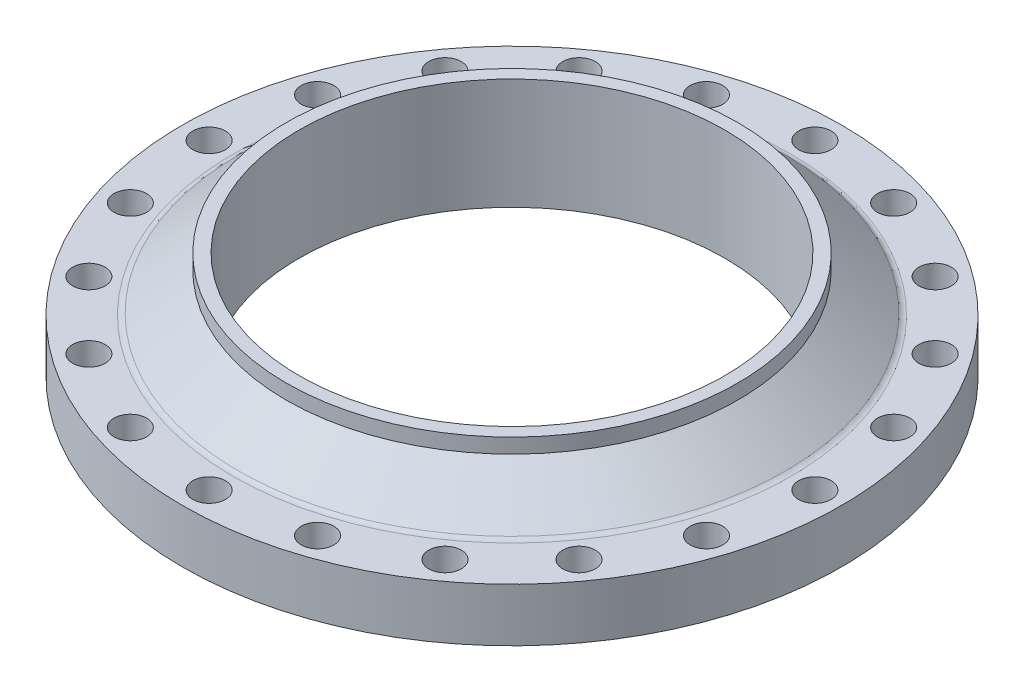
ISO-10303-21;
HEADER;
FILE_DESCRIPTION(('STEP AP214'),'2;1');
FILE_NAME('part.step','',(''),(''),'','','');
FILE_SCHEMA(('AUTOMOTIVE_DESIGN { 1 0 10303 214 1 1 1 1 }'));
ENDSEC;
DATA;
#1=APPLICATION_CONTEXT('core data for automotive mechanical design processes');
#2=APPLICATION_PROTOCOL_DEFINITION('international standard','automotive_design',2000,#1);
#3=PRODUCT_CONTEXT('',#1,'mechanical');
#4=PRODUCT('Part','Part','',(#3));
#5=PRODUCT_RELATED_PRODUCT_CATEGORY('part','',(#4));
#6=PRODUCT_DEFINITION_FORMATION('','',#4);
#7=PRODUCT_DEFINITION_CONTEXT('part definition',#1,'design');
#8=PRODUCT_DEFINITION('design','',#6,#7);
#9=PRODUCT_DEFINITION_SHAPE('','',#8);
#10=(LENGTH_UNIT() NAMED_UNIT(*) SI_UNIT(.MILLI.,.METRE.));
#11=(NAMED_UNIT(*) PLANE_ANGLE_UNIT() SI_UNIT($,.RADIAN.));
#12=(NAMED_UNIT(*) SI_UNIT($,.STERADIAN.) SOLID_ANGLE_UNIT());
#13=UNCERTAINTY_MEASURE_WITH_UNIT(LENGTH_MEASURE(1.E-05),#10,'distance_accuracy_value','');
#14=(GEOMETRIC_REPRESENTATION_CONTEXT(3) GLOBAL_UNCERTAINTY_ASSIGNED_CONTEXT((#13)) GLOBAL_UNIT_ASSIGNED_CONTEXT((#10,
#11,#12)) REPRESENTATION_CONTEXT('',''));
#15=CARTESIAN_POINT('',(0.,0.,0.));
#16=DIRECTION('',(0.,0.,1.));
#17=DIRECTION('',(1.,0.,0.));
#18=AXIS2_PLACEMENT_3D('',#15,#16,#17);
#19=CARTESIAN_POINT('',(370.,50.8119327908328,0.));
#20=DIRECTION('',(0.,-1.,0.));
#21=DIRECTION('',(0.,0.,-1.));
#22=AXIS2_PLACEMENT_3D('',#19,#20,#21);
#23=PLANE('',#22);
#24=CARTESIAN_POINT('',(0.,50.8119327908328,0.));
#25=DIRECTION('',(0.,-1.,0.));
#26=DIRECTION('',(0.,0.,-1.));
#27=AXIS2_PLACEMENT_3D('',#24,#25,#26);
#28=CIRCLE('',#27,370.);
#29=CARTESIAN_POINT('',(0.,50.8119327908328,-370.));
#30=VERTEX_POINT('',#29);
#31=EDGE_CURVE('E10',#30,#30,#28,.T.);
#32=ORIENTED_EDGE('',*,*,#31,.T.);
#33=EDGE_LOOP('',(#32));
#34=FACE_BOUND('',#33,.T.);
#35=CARTESIAN_POINT('',(0.,50.8119327908328,0.));
#36=DIRECTION('',(0.,-1.,0.));
#37=DIRECTION('',(0.,0.,-1.));
#38=AXIS2_PLACEMENT_3D('',#35,#36,#37);
#39=CIRCLE('',#38,287.4);
#40=CARTESIAN_POINT('',(0.,50.8119327908328,-287.4));
#41=VERTEX_POINT('',#40);
#42=EDGE_CURVE('E65',#41,#41,#39,.T.);
#43=ORIENTED_EDGE('',*,*,#42,.F.);
#44=EDGE_LOOP('',(#43));
#45=FACE_BOUND('',#44,.T.);
#46=ADVANCED_FACE('F31',(#34,#45),#23,.T.);
#47=CARTESIAN_POINT('',(0.,50.8119327908328,0.));
#48=DIRECTION('',(0.,1.,0.));
#49=DIRECTION('',(0.,0.,1.));
#50=AXIS2_PLACEMENT_3D('',#47,#48,#49);
#51=CONICAL_SURFACE('',#50,370.,0.785398163397448);
#52=CARTESIAN_POINT('',(0.,55.8119327908329,0.));
#53=DIRECTION('',(0.,-1.,0.));
#54=DIRECTION('',(0.,0.,-1.));
#55=AXIS2_PLACEMENT_3D('',#52,#53,#54);
#56=CIRCLE('',#55,375.);
#57=CARTESIAN_POINT('',(0.,55.8119327908329,-375.));
#58=VERTEX_POINT('',#57);
#59=EDGE_CURVE('E37',#58,#58,#56,.T.);
#60=ORIENTED_EDGE('',*,*,#59,.T.);
#61=EDGE_LOOP('',(#60));
#62=FACE_BOUND('',#61,.T.);
#63=ORIENTED_EDGE('',*,*,#31,.F.);
#64=EDGE_LOOP('',(#63));
#65=FACE_BOUND('',#64,.T.);
#66=ADVANCED_FACE('F195',(#62,#65),#51,.T.);
#67=CARTESIAN_POINT('',(445.,55.8119327908329,0.));
#68=DIRECTION('',(0.,-1.,0.));
#69=DIRECTION('',(0.,0.,-1.));
#70=AXIS2_PLACEMENT_3D('',#67,#68,#69);
#71=PLANE('',#70);
#72=CARTESIAN_POINT('',(-388.982115164702,55.8119327908329,126.387950699331));
#73=DIRECTION('',(0.,-1.,0.));
#74=DIRECTION('',(0.,0.,-1.));
#75=AXIS2_PLACEMENT_3D('',#72,#73,#74);
#76=CIRCLE('',#75,22.0000000000263);
#77=CARTESIAN_POINT('',(-388.982115164702,55.8119327908329,104.387950699305));
#78=VERTEX_POINT('',#77);
#79=EDGE_CURVE('E126',#78,#78,#76,.T.);
#80=ORIENTED_EDGE('',*,*,#79,.F.);
#81=EDGE_LOOP('',(#80));
#82=FACE_BOUND('',#81,.T.);
#83=CARTESIAN_POINT('',(-408.999999999977,55.8119327908329,-2.32489583140705E-11));
#84=DIRECTION('',(0.,-1.,0.));
#85=DIRECTION('',(0.,0.,-1.));
#86=AXIS2_PLACEMENT_3D('',#83,#84,#85);
#87=CIRCLE('',#86,22.0000000000331);
#88=CARTESIAN_POINT('',(-408.999999999977,55.8119327908329,-22.0000000000563));
#89=VERTEX_POINT('',#88);
#90=EDGE_CURVE('E133',#89,#89,#87,.T.);
#91=ORIENTED_EDGE('',*,*,#90,.F.);
#92=EDGE_LOOP('',(#91));
#93=FACE_BOUND('',#92,.T.);
#94=CARTESIAN_POINT('',(-388.982115164687,55.8119327908329,-126.387950699376));
#95=DIRECTION('',(0.,-1.,0.));
#96=DIRECTION('',(0.,0.,-1.));
#97=AXIS2_PLACEMENT_3D('',#94,#95,#96);
#98=CIRCLE('',#97,22.0000000000393);
#99=CARTESIAN_POINT('',(-388.982115164687,55.8119327908329,-148.387950699415));
#100=VERTEX_POINT('',#99);
#101=EDGE_CURVE('E139',#100,#100,#98,.T.);
#102=ORIENTED_EDGE('',*,*,#101,.F.);
#103=EDGE_LOOP('',(#102));
#104=FACE_BOUND('',#103,.T.);
#105=CARTESIAN_POINT('',(-330.887950699317,55.8119327908329,-240.40416818764));
#106=DIRECTION('',(0.,-1.,0.));
#107=DIRECTION('',(0.,0.,-1.));
#108=AXIS2_PLACEMENT_3D('',#105,#106,#107);
#109=CIRCLE('',#108,22.0000000000445);
#110=CARTESIAN_POINT('',(-330.887950699317,55.8119327908329,-262.404168187685));
#111=VERTEX_POINT('',#110);
#112=EDGE_CURVE('E145',#111,#111,#109,.T.);
#113=ORIENTED_EDGE('',*,*,#112,.F.);
#114=EDGE_LOOP('',(#113));
#115=FACE_BOUND('',#114,.T.);
#116=CARTESIAN_POINT('',(-240.40416818758,55.8119327908329,-330.887950699367));
#117=DIRECTION('',(0.,-1.,0.));
#118=DIRECTION('',(0.,0.,-1.));
#119=AXIS2_PLACEMENT_3D('',#116,#117,#118);
#120=CIRCLE('',#119,22.0000000000475);
#121=CARTESIAN_POINT('',(-240.40416818758,55.8119327908329,-352.887950699415));
#122=VERTEX_POINT('',#121);
#123=EDGE_CURVE('E151',#122,#122,#120,.T.);
#124=ORIENTED_EDGE('',*,*,#123,.F.);
#125=EDGE_LOOP('',(#124));
#126=FACE_BOUND('',#125,.T.);
#127=CARTESIAN_POINT('',(-126.387950699308,55.8119327908329,-388.982115164725));
#128=DIRECTION('',(0.,-1.,0.));
#129=DIRECTION('',(0.,0.,-1.));
#130=AXIS2_PLACEMENT_3D('',#127,#128,#129);
#131=CIRCLE('',#130,22.0000000000484);
#132=CARTESIAN_POINT('',(-126.387950699308,55.8119327908329,-410.982115164773));
#133=VERTEX_POINT('',#132);
#134=EDGE_CURVE('E157',#133,#133,#131,.T.);
#135=ORIENTED_EDGE('',*,*,#134,.F.);
#136=EDGE_LOOP('',(#135));
#137=FACE_BOUND('',#136,.T.);
#138=CARTESIAN_POINT('',(4.63977405199707E-11,55.8119327908329,-409.));
#139=DIRECTION('',(0.,-1.,0.));
#140=DIRECTION('',(0.,0.,-1.));
#141=AXIS2_PLACEMENT_3D('',#138,#139,#140);
#142=CIRCLE('',#141,22.0000000000471);
#143=CARTESIAN_POINT('',(4.63977405199707E-11,55.8119327908329,-431.000000000047));
#144=VERTEX_POINT('',#143);
#145=EDGE_CURVE('E163',#144,#144,#142,.T.);
#146=ORIENTED_EDGE('',*,*,#145,.F.);
#147=EDGE_LOOP('',(#146));
#148=FACE_BOUND('',#147,.T.);
#149=CARTESIAN_POINT('',(126.387950699399,55.8119327908329,-388.982115164711));
#150=DIRECTION('',(0.,-1.,0.));
#151=DIRECTION('',(0.,0.,-1.));
#152=AXIS2_PLACEMENT_3D('',#149,#150,#151);
#153=CIRCLE('',#152,22.0000000000438);
#154=CARTESIAN_POINT('',(126.387950699399,55.8119327908329,-410.982115164754));
#155=VERTEX_POINT('',#154);
#156=EDGE_CURVE('E79',#155,#155,#153,.T.);
#157=ORIENTED_EDGE('',*,*,#156,.F.);
#158=EDGE_LOOP('',(#157));
#159=FACE_BOUND('',#158,.T.);
#160=CARTESIAN_POINT('',(240.404168187663,55.8119327908329,-330.88795069934));
#161=DIRECTION('',(0.,-1.,0.));
#162=DIRECTION('',(0.,0.,-1.));
#163=AXIS2_PLACEMENT_3D('',#160,#161,#162);
#164=CIRCLE('',#163,22.0000000000384);
#165=CARTESIAN_POINT('',(240.404168187663,55.8119327908329,-352.887950699378));
#166=VERTEX_POINT('',#165);
#167=EDGE_CURVE('E78',#166,#166,#164,.T.);
#168=ORIENTED_EDGE('',*,*,#167,.F.);
#169=EDGE_LOOP('',(#168));
#170=FACE_BOUND('',#169,.T.);
#171=CARTESIAN_POINT('',(330.88795069939,55.8119327908329,-240.404168187603));
#172=DIRECTION('',(0.,-1.,0.));
#173=DIRECTION('',(0.,0.,-1.));
#174=AXIS2_PLACEMENT_3D('',#171,#172,#173);
#175=CIRCLE('',#174,22.0000000000316);
#176=CARTESIAN_POINT('',(330.88795069939,55.8119327908329,-262.404168187634));
#177=VERTEX_POINT('',#176);
#178=EDGE_CURVE('E85',#177,#177,#175,.T.);
#179=ORIENTED_EDGE('',*,*,#178,.F.);
#180=EDGE_LOOP('',(#179));
#181=FACE_BOUND('',#180,.T.);
#182=CARTESIAN_POINT('',(388.982115164748,55.8119327908329,-126.387950699331));
#183=DIRECTION('',(0.,-1.,0.));
#184=DIRECTION('',(0.,0.,-1.));
#185=AXIS2_PLACEMENT_3D('',#182,#183,#184);
#186=CIRCLE('',#185,22.0000000000243);
#187=CARTESIAN_POINT('',(388.982115164748,55.8119327908329,-148.387950699356));
#188=VERTEX_POINT('',#187);
#189=EDGE_CURVE('E91',#188,#188,#186,.T.);
#190=ORIENTED_EDGE('',*,*,#189,.F.);
#191=EDGE_LOOP('',(#190));
#192=FACE_BOUND('',#191,.T.);
#193=CARTESIAN_POINT('',(409.000000000023,55.8119327908329,2.31988702599853E-11));
#194=DIRECTION('',(0.,-1.,0.));
#195=DIRECTION('',(0.,0.,-1.));
#196=AXIS2_PLACEMENT_3D('',#193,#194,#195);
#197=CIRCLE('',#196,22.0000000000168);
#198=CARTESIAN_POINT('',(409.000000000023,55.8119327908329,-21.9999999999936));
#199=VERTEX_POINT('',#198);
#200=EDGE_CURVE('E97',#199,#199,#197,.T.);
#201=ORIENTED_EDGE('',*,*,#200,.F.);
#202=EDGE_LOOP('',(#201));
#203=FACE_BOUND('',#202,.T.);
#204=CARTESIAN_POINT('',(388.982115164734,55.8119327908329,126.387950699376));
#205=DIRECTION('',(0.,-1.,0.));
#206=DIRECTION('',(0.,0.,-1.));
#207=AXIS2_PLACEMENT_3D('',#204,#205,#206);
#208=CIRCLE('',#207,22.00000000001);
#209=CARTESIAN_POINT('',(388.982115164734,55.8119327908329,104.387950699366));
#210=VERTEX_POINT('',#209);
#211=EDGE_CURVE('E103',#210,#210,#208,.T.);
#212=ORIENTED_EDGE('',*,*,#211,.F.);
#213=EDGE_LOOP('',(#212));
#214=FACE_BOUND('',#213,.T.);
#215=CARTESIAN_POINT('',(330.887950699363,55.8119327908329,240.40416818764));
#216=DIRECTION('',(0.,-1.,0.));
#217=DIRECTION('',(0.,0.,-1.));
#218=AXIS2_PLACEMENT_3D('',#215,#216,#217);
#219=CIRCLE('',#218,22.0000000000045);
#220=CARTESIAN_POINT('',(330.887950699363,55.8119327908329,218.404168187636));
#221=VERTEX_POINT('',#220);
#222=EDGE_CURVE('E109',#221,#221,#219,.T.);
#223=ORIENTED_EDGE('',*,*,#222,.F.);
#224=EDGE_LOOP('',(#223));
#225=FACE_BOUND('',#224,.T.);
#226=CARTESIAN_POINT('',(240.404168187626,55.8119327908329,330.887950699367));
#227=DIRECTION('',(0.,-1.,0.));
#228=DIRECTION('',(0.,0.,-1.));
#229=AXIS2_PLACEMENT_3D('',#226,#227,#228);
#230=CIRCLE('',#229,22.0000000000008);
#231=CARTESIAN_POINT('',(240.404168187626,55.8119327908329,308.887950699366));
#232=VERTEX_POINT('',#231);
#233=EDGE_CURVE('E115',#232,#232,#230,.T.);
#234=ORIENTED_EDGE('',*,*,#233,.F.);
#235=EDGE_LOOP('',(#234));
#236=FACE_BOUND('',#235,.T.);
#237=CARTESIAN_POINT('',(126.387950699354,55.8119327908329,388.982115164718));
#238=DIRECTION('',(0.,-1.,0.));
#239=DIRECTION('',(0.,0.,-1.));
#240=AXIS2_PLACEMENT_3D('',#237,#238,#239);
#241=CIRCLE('',#240,22.);
#242=CARTESIAN_POINT('',(126.387950699354,55.8119327908329,366.982115164718));
#243=VERTEX_POINT('',#242);
#244=EDGE_CURVE('E72',#243,#243,#241,.T.);
#245=ORIENTED_EDGE('',*,*,#244,.F.);
#246=EDGE_LOOP('',(#245));
#247=FACE_BOUND('',#246,.T.);
#248=CARTESIAN_POINT('',(-330.887950699344,55.8119327908329,240.404168187603));
#249=DIRECTION('',(0.,-1.,0.));
#250=DIRECTION('',(0.,0.,-1.));
#251=AXIS2_PLACEMENT_3D('',#248,#249,#250);
#252=CIRCLE('',#251,22.0000000000195);
#253=CARTESIAN_POINT('',(-330.887950699344,55.8119327908329,218.404168187583));
#254=VERTEX_POINT('',#253);
#255=EDGE_CURVE('E127',#254,#254,#252,.T.);
#256=ORIENTED_EDGE('',*,*,#255,.F.);
#257=EDGE_LOOP('',(#256));
#258=FACE_BOUND('',#257,.T.);
#259=CARTESIAN_POINT('',(-240.404168187617,55.8119327908329,330.88795069934));
#260=DIRECTION('',(0.,-1.,0.));
#261=DIRECTION('',(0.,0.,-1.));
#262=AXIS2_PLACEMENT_3D('',#259,#260,#261);
#263=CIRCLE('',#262,22.0000000000134);
#264=CARTESIAN_POINT('',(-240.404168187617,55.8119327908329,308.887950699326));
#265=VERTEX_POINT('',#264);
#266=EDGE_CURVE('E180',#265,#265,#263,.T.);
#267=ORIENTED_EDGE('',*,*,#266,.F.);
#268=EDGE_LOOP('',(#267));
#269=FACE_BOUND('',#268,.T.);
#270=CARTESIAN_POINT('',(-126.387950699352,55.8119327908329,388.982115164711));
#271=DIRECTION('',(0.,-1.,0.));
#272=DIRECTION('',(0.,0.,-1.));
#273=AXIS2_PLACEMENT_3D('',#270,#271,#272);
#274=CIRCLE('',#273,22.0000000000085);
#275=CARTESIAN_POINT('',(-126.387950699352,55.8119327908329,366.982115164702));
#276=VERTEX_POINT('',#275);
#277=EDGE_CURVE('E174',#276,#276,#274,.T.);
#278=ORIENTED_EDGE('',*,*,#277,.F.);
#279=EDGE_LOOP('',(#278));
#280=FACE_BOUND('',#279,.T.);
#281=CARTESIAN_POINT('',(0.,55.8119327908329,409.));
#282=DIRECTION('',(0.,-1.,0.));
#283=DIRECTION('',(0.,0.,-1.));
#284=AXIS2_PLACEMENT_3D('',#281,#282,#283);
#285=CIRCLE('',#284,22.);
#286=CARTESIAN_POINT('',(0.,55.8119327908329,387.));
#287=VERTEX_POINT('',#286);
#288=EDGE_CURVE('E68',#287,#287,#285,.T.);
#289=ORIENTED_EDGE('',*,*,#288,.F.);
#290=EDGE_LOOP('',(#289));
#291=FACE_BOUND('',#290,.T.);
#292=CARTESIAN_POINT('',(0.,55.8119327908329,0.));
#293=DIRECTION('',(0.,-1.,0.));
#294=DIRECTION('',(0.,0.,-1.));
#295=AXIS2_PLACEMENT_3D('',#292,#293,#294);
#296=CIRCLE('',#295,445.);
#297=CARTESIAN_POINT('',(0.,55.8119327908329,-445.));
#298=VERTEX_POINT('',#297);
#299=EDGE_CURVE('E41',#298,#298,#296,.T.);
#300=ORIENTED_EDGE('',*,*,#299,.T.);
#301=EDGE_LOOP('',(#300));
#302=FACE_BOUND('',#301,.T.);
#303=ORIENTED_EDGE('',*,*,#59,.F.);
#304=EDGE_LOOP('',(#303));
#305=FACE_BOUND('',#304,.T.);
#306=ADVANCED_FACE('F191',(#82,#93,#104,#115,#126,#137,#148,#159,#170,#181,#192,#203,#214,#225,
#236,#247,#258,#269,#280,#291,#302,#305),#71,.T.);
#307=CARTESIAN_POINT('',(0.,0.,0.));
#308=DIRECTION('',(0.,-1.,0.));
#309=DIRECTION('',(0.,0.,-1.));
#310=AXIS2_PLACEMENT_3D('',#307,#308,#309);
#311=CYLINDRICAL_SURFACE('',#310,445.);
#312=CARTESIAN_POINT('',(0.,127.811932790833,0.));
#313=DIRECTION('',(0.,-1.,0.));
#314=DIRECTION('',(0.,0.,-1.));
#315=AXIS2_PLACEMENT_3D('',#312,#313,#314);
#316=CIRCLE('',#315,445.);
#317=CARTESIAN_POINT('',(0.,127.811932790833,-445.));
#318=VERTEX_POINT('',#317);
#319=EDGE_CURVE('E45',#318,#318,#316,.T.);
#320=ORIENTED_EDGE('',*,*,#319,.T.);
#321=EDGE_LOOP('',(#320));
#322=FACE_BOUND('',#321,.T.);
#323=ORIENTED_EDGE('',*,*,#299,.F.);
#324=EDGE_LOOP('',(#323));
#325=FACE_BOUND('',#324,.T.);
#326=ADVANCED_FACE('F194',(#322,#325),#311,.T.);
#327=CARTESIAN_POINT('',(376.768837865709,127.811932790833,0.));
#328=DIRECTION('',(0.,1.,0.));
#329=DIRECTION('',(0.,0.,1.));
#330=AXIS2_PLACEMENT_3D('',#327,#328,#329);
#331=PLANE('',#330);
#332=CARTESIAN_POINT('',(-388.982115164702,127.811932790833,126.387950699331));
#333=DIRECTION('',(0.,1.,0.));
#334=DIRECTION('',(0.,0.,1.));
#335=AXIS2_PLACEMENT_3D('',#332,#333,#334);
#336=CIRCLE('',#335,22.0000000000263);
#337=CARTESIAN_POINT('',(-388.982115164702,127.811932790833,148.387950699358));
#338=VERTEX_POINT('',#337);
#339=EDGE_CURVE('E123',#338,#338,#336,.F.);
#340=ORIENTED_EDGE('',*,*,#339,.T.);
#341=EDGE_LOOP('',(#340));
#342=FACE_BOUND('',#341,.T.);
#343=CARTESIAN_POINT('',(-408.999999999977,127.811932790833,-2.32489583140705E-11));
#344=DIRECTION('',(0.,1.,0.));
#345=DIRECTION('',(0.,0.,1.));
#346=AXIS2_PLACEMENT_3D('',#343,#344,#345);
#347=CIRCLE('',#346,22.0000000000331);
#348=CARTESIAN_POINT('',(-408.999999999977,127.811932790833,22.0000000000099));
#349=VERTEX_POINT('',#348);
#350=EDGE_CURVE('E130',#349,#349,#347,.F.);
#351=ORIENTED_EDGE('',*,*,#350,.T.);
#352=EDGE_LOOP('',(#351));
#353=FACE_BOUND('',#352,.T.);
#354=CARTESIAN_POINT('',(-388.982115164687,127.811932790833,-126.387950699376));
#355=DIRECTION('',(0.,1.,0.));
#356=DIRECTION('',(0.,0.,1.));
#357=AXIS2_PLACEMENT_3D('',#354,#355,#356);
#358=CIRCLE('',#357,22.0000000000393);
#359=CARTESIAN_POINT('',(-388.982115164687,127.811932790833,-104.387950699336));
#360=VERTEX_POINT('',#359);
#361=EDGE_CURVE('E136',#360,#360,#358,.F.);
#362=ORIENTED_EDGE('',*,*,#361,.T.);
#363=EDGE_LOOP('',(#362));
#364=FACE_BOUND('',#363,.T.);
#365=CARTESIAN_POINT('',(-330.887950699317,127.811932790833,-240.40416818764));
#366=DIRECTION('',(0.,1.,0.));
#367=DIRECTION('',(0.,0.,1.));
#368=AXIS2_PLACEMENT_3D('',#365,#366,#367);
#369=CIRCLE('',#368,22.0000000000445);
#370=CARTESIAN_POINT('',(-330.887950699317,127.811932790833,-218.404168187596));
#371=VERTEX_POINT('',#370);
#372=EDGE_CURVE('E142',#371,#371,#369,.F.);
#373=ORIENTED_EDGE('',*,*,#372,.T.);
#374=EDGE_LOOP('',(#373));
#375=FACE_BOUND('',#374,.T.);
#376=CARTESIAN_POINT('',(-240.40416818758,127.811932790833,-330.887950699367));
#377=DIRECTION('',(0.,1.,0.));
#378=DIRECTION('',(0.,0.,1.));
#379=AXIS2_PLACEMENT_3D('',#376,#377,#378);
#380=CIRCLE('',#379,22.0000000000475);
#381=CARTESIAN_POINT('',(-240.40416818758,127.811932790833,-308.88795069932));
#382=VERTEX_POINT('',#381);
#383=EDGE_CURVE('E148',#382,#382,#380,.F.);
#384=ORIENTED_EDGE('',*,*,#383,.T.);
#385=EDGE_LOOP('',(#384));
#386=FACE_BOUND('',#385,.T.);
#387=CARTESIAN_POINT('',(-126.387950699308,127.811932790833,-388.982115164725));
#388=DIRECTION('',(0.,1.,0.));
#389=DIRECTION('',(0.,0.,1.));
#390=AXIS2_PLACEMENT_3D('',#387,#388,#389);
#391=CIRCLE('',#390,22.0000000000484);
#392=CARTESIAN_POINT('',(-126.387950699308,127.811932790833,-366.982115164677));
#393=VERTEX_POINT('',#392);
#394=EDGE_CURVE('E154',#393,#393,#391,.F.);
#395=ORIENTED_EDGE('',*,*,#394,.T.);
#396=EDGE_LOOP('',(#395));
#397=FACE_BOUND('',#396,.T.);
#398=CARTESIAN_POINT('',(4.63977405199707E-11,127.811932790833,-409.));
#399=DIRECTION('',(0.,1.,0.));
#400=DIRECTION('',(0.,0.,1.));
#401=AXIS2_PLACEMENT_3D('',#398,#399,#400);
#402=CIRCLE('',#401,22.0000000000471);
#403=CARTESIAN_POINT('',(4.63977405199707E-11,127.811932790833,-386.999999999953));
#404=VERTEX_POINT('',#403);
#405=EDGE_CURVE('E160',#404,#404,#402,.F.);
#406=ORIENTED_EDGE('',*,*,#405,.T.);
#407=EDGE_LOOP('',(#406));
#408=FACE_BOUND('',#407,.T.);
#409=CARTESIAN_POINT('',(126.387950699399,127.811932790833,-388.982115164711));
#410=DIRECTION('',(0.,1.,0.));
#411=DIRECTION('',(0.,0.,1.));
#412=AXIS2_PLACEMENT_3D('',#409,#410,#411);
#413=CIRCLE('',#412,22.0000000000438);
#414=CARTESIAN_POINT('',(126.387950699399,127.811932790833,-366.982115164667));
#415=VERTEX_POINT('',#414);
#416=EDGE_CURVE('E166',#415,#415,#413,.F.);
#417=ORIENTED_EDGE('',*,*,#416,.T.);
#418=EDGE_LOOP('',(#417));
#419=FACE_BOUND('',#418,.T.);
#420=CARTESIAN_POINT('',(240.404168187663,127.811932790833,-330.88795069934));
#421=DIRECTION('',(0.,1.,0.));
#422=DIRECTION('',(0.,0.,1.));
#423=AXIS2_PLACEMENT_3D('',#420,#421,#422);
#424=CIRCLE('',#423,22.0000000000384);
#425=CARTESIAN_POINT('',(240.404168187663,127.811932790833,-308.887950699301));
#426=VERTEX_POINT('',#425);
#427=EDGE_CURVE('E75',#426,#426,#424,.F.);
#428=ORIENTED_EDGE('',*,*,#427,.T.);
#429=EDGE_LOOP('',(#428));
#430=FACE_BOUND('',#429,.T.);
#431=CARTESIAN_POINT('',(330.88795069939,127.811932790833,-240.404168187603));
#432=DIRECTION('',(0.,1.,0.));
#433=DIRECTION('',(0.,0.,1.));
#434=AXIS2_PLACEMENT_3D('',#431,#432,#433);
#435=CIRCLE('',#434,22.0000000000316);
#436=CARTESIAN_POINT('',(330.88795069939,127.811932790833,-218.404168187571));
#437=VERTEX_POINT('',#436);
#438=EDGE_CURVE('E82',#437,#437,#435,.F.);
#439=ORIENTED_EDGE('',*,*,#438,.T.);
#440=EDGE_LOOP('',(#439));
#441=FACE_BOUND('',#440,.T.);
#442=CARTESIAN_POINT('',(388.982115164748,127.811932790833,-126.387950699331));
#443=DIRECTION('',(0.,1.,0.));
#444=DIRECTION('',(0.,0.,1.));
#445=AXIS2_PLACEMENT_3D('',#442,#443,#444);
#446=CIRCLE('',#445,22.0000000000243);
#447=CARTESIAN_POINT('',(388.982115164748,127.811932790833,-104.387950699307));
#448=VERTEX_POINT('',#447);
#449=EDGE_CURVE('E88',#448,#448,#446,.F.);
#450=ORIENTED_EDGE('',*,*,#449,.T.);
#451=EDGE_LOOP('',(#450));
#452=FACE_BOUND('',#451,.T.);
#453=CARTESIAN_POINT('',(409.000000000023,127.811932790833,2.31988702599853E-11));
#454=DIRECTION('',(0.,1.,0.));
#455=DIRECTION('',(0.,0.,1.));
#456=AXIS2_PLACEMENT_3D('',#453,#454,#455);
#457=CIRCLE('',#456,22.0000000000168);
#458=CARTESIAN_POINT('',(409.000000000023,127.811932790833,22.00000000004));
#459=VERTEX_POINT('',#458);
#460=EDGE_CURVE('E94',#459,#459,#457,.F.);
#461=ORIENTED_EDGE('',*,*,#460,.T.);
#462=EDGE_LOOP('',(#461));
#463=FACE_BOUND('',#462,.T.);
#464=CARTESIAN_POINT('',(388.982115164734,127.811932790833,126.387950699376));
#465=DIRECTION('',(0.,1.,0.));
#466=DIRECTION('',(0.,0.,1.));
#467=AXIS2_PLACEMENT_3D('',#464,#465,#466);
#468=CIRCLE('',#467,22.00000000001);
#469=CARTESIAN_POINT('',(388.982115164734,127.811932790833,148.387950699386));
#470=VERTEX_POINT('',#469);
#471=EDGE_CURVE('E100',#470,#470,#468,.F.);
#472=ORIENTED_EDGE('',*,*,#471,.T.);
#473=EDGE_LOOP('',(#472));
#474=FACE_BOUND('',#473,.T.);
#475=CARTESIAN_POINT('',(330.887950699363,127.811932790833,240.40416818764));
#476=DIRECTION('',(0.,1.,0.));
#477=DIRECTION('',(0.,0.,1.));
#478=AXIS2_PLACEMENT_3D('',#475,#476,#477);
#479=CIRCLE('',#478,22.0000000000045);
#480=CARTESIAN_POINT('',(330.887950699363,127.811932790833,262.404168187645));
#481=VERTEX_POINT('',#480);
#482=EDGE_CURVE('E106',#481,#481,#479,.F.);
#483=ORIENTED_EDGE('',*,*,#482,.T.);
#484=EDGE_LOOP('',(#483));
#485=FACE_BOUND('',#484,.T.);
#486=CARTESIAN_POINT('',(240.404168187626,127.811932790833,330.887950699367));
#487=DIRECTION('',(0.,1.,0.));
#488=DIRECTION('',(0.,0.,1.));
#489=AXIS2_PLACEMENT_3D('',#486,#487,#488);
#490=CIRCLE('',#489,22.0000000000008);
#491=CARTESIAN_POINT('',(240.404168187626,127.811932790833,352.887950699368));
#492=VERTEX_POINT('',#491);
#493=EDGE_CURVE('E112',#492,#492,#490,.F.);
#494=ORIENTED_EDGE('',*,*,#493,.T.);
#495=EDGE_LOOP('',(#494));
#496=FACE_BOUND('',#495,.T.);
#497=CARTESIAN_POINT('',(126.387950699354,127.811932790833,388.982115164718));
#498=DIRECTION('',(0.,1.,0.));
#499=DIRECTION('',(0.,0.,1.));
#500=AXIS2_PLACEMENT_3D('',#497,#498,#499);
#501=CIRCLE('',#500,22.);
#502=CARTESIAN_POINT('',(126.387950699354,127.811932790833,410.982115164718));
#503=VERTEX_POINT('',#502);
#504=EDGE_CURVE('E118',#503,#503,#501,.F.);
#505=ORIENTED_EDGE('',*,*,#504,.T.);
#506=EDGE_LOOP('',(#505));
#507=FACE_BOUND('',#506,.T.);
#508=CARTESIAN_POINT('',(-330.887950699344,127.811932790833,240.404168187603));
#509=DIRECTION('',(0.,1.,0.));
#510=DIRECTION('',(0.,0.,1.));
#511=AXIS2_PLACEMENT_3D('',#508,#509,#510);
#512=CIRCLE('',#511,22.0000000000195);
#513=CARTESIAN_POINT('',(-330.887950699344,127.811932790833,262.404168187622));
#514=VERTEX_POINT('',#513);
#515=EDGE_CURVE('E183',#514,#514,#512,.F.);
#516=ORIENTED_EDGE('',*,*,#515,.T.);
#517=EDGE_LOOP('',(#516));
#518=FACE_BOUND('',#517,.T.);
#519=CARTESIAN_POINT('',(-240.404168187617,127.811932790833,330.88795069934));
#520=DIRECTION('',(0.,1.,0.));
#521=DIRECTION('',(0.,0.,1.));
#522=AXIS2_PLACEMENT_3D('',#519,#520,#521);
#523=CIRCLE('',#522,22.0000000000134);
#524=CARTESIAN_POINT('',(-240.404168187617,127.811932790833,352.887950699353));
#525=VERTEX_POINT('',#524);
#526=EDGE_CURVE('E177',#525,#525,#523,.F.);
#527=ORIENTED_EDGE('',*,*,#526,.T.);
#528=EDGE_LOOP('',(#527));
#529=FACE_BOUND('',#528,.T.);
#530=CARTESIAN_POINT('',(-126.387950699352,127.811932790833,388.982115164711));
#531=DIRECTION('',(0.,1.,0.));
#532=DIRECTION('',(0.,0.,1.));
#533=AXIS2_PLACEMENT_3D('',#530,#531,#532);
#534=CIRCLE('',#533,22.0000000000085);
#535=CARTESIAN_POINT('',(-126.387950699352,127.811932790833,410.982115164719));
#536=VERTEX_POINT('',#535);
#537=EDGE_CURVE('E171',#536,#536,#534,.F.);
#538=ORIENTED_EDGE('',*,*,#537,.T.);
#539=EDGE_LOOP('',(#538));
#540=FACE_BOUND('',#539,.T.);
#541=CARTESIAN_POINT('',(0.,127.811932790833,409.));
#542=DIRECTION('',(0.,1.,0.));
#543=DIRECTION('',(0.,0.,1.));
#544=AXIS2_PLACEMENT_3D('',#541,#542,#543);
#545=CIRCLE('',#544,22.);
#546=CARTESIAN_POINT('',(0.,127.811932790833,431.));
#547=VERTEX_POINT('',#546);
#548=EDGE_CURVE('E69',#547,#547,#545,.F.);
#549=ORIENTED_EDGE('',*,*,#548,.T.);
#550=EDGE_LOOP('',(#549));
#551=FACE_BOUND('',#550,.T.);
#552=CARTESIAN_POINT('',(0.,127.811932790833,0.));
#553=DIRECTION('',(0.,-1.,0.));
#554=DIRECTION('',(0.,0.,-1.));
#555=AXIS2_PLACEMENT_3D('',#552,#553,#554);
#556=CIRCLE('',#555,376.768837865709);
#557=CARTESIAN_POINT('',(0.,127.811932790833,-376.768837865709));
#558=VERTEX_POINT('',#557);
#559=EDGE_CURVE('E50',#558,#558,#556,.T.);
#560=ORIENTED_EDGE('',*,*,#559,.T.);
#561=EDGE_LOOP('',(#560));
#562=FACE_BOUND('',#561,.T.);
#563=ORIENTED_EDGE('',*,*,#319,.F.);
#564=EDGE_LOOP('',(#563));
#565=FACE_BOUND('',#564,.T.);
#566=ADVANCED_FACE('F208',(#342,#353,#364,#375,#386,#397,#408,#419,#430,#441,#452,#463,#474,
#485,#496,#507,#518,#529,#540,#551,#562,#565),#331,.T.);
#567=CARTESIAN_POINT('',(0.,139.811932790833,0.));
#568=DIRECTION('',(0.,-1.,0.));
#569=DIRECTION('',(0.,0.,-1.));
#570=AXIS2_PLACEMENT_3D('',#567,#568,#569);
#571=TOROIDAL_SURFACE('',#570,376.768837865709,12.);
#572=CARTESIAN_POINT('',(0.,130.355803747552,0.));
#573=DIRECTION('',(0.,-1.,0.));
#574=DIRECTION('',(0.,0.,-1.));
#575=AXIS2_PLACEMENT_3D('',#572,#573,#574);
#576=CIRCLE('',#575,369.380900161801);
#577=CARTESIAN_POINT('',(0.,130.355803747552,-369.380900161801));
#578=VERTEX_POINT('',#577);
#579=EDGE_CURVE('E53',#578,#578,#576,.T.);
#580=ORIENTED_EDGE('',*,*,#579,.T.);
#581=EDGE_LOOP('',(#580));
#582=FACE_BOUND('',#581,.T.);
#583=ORIENTED_EDGE('',*,*,#559,.F.);
#584=EDGE_LOOP('',(#583));
#585=FACE_BOUND('',#584,.T.);
#586=ADVANCED_FACE('F214',(#582,#585),#571,.F.);
#587=CARTESIAN_POINT('',(0.,130.355803747552,0.));
#588=DIRECTION('',(0.,-1.,0.));
#589=DIRECTION('',(0.,0.,-1.));
#590=AXIS2_PLACEMENT_3D('',#587,#588,#589);
#591=CONICAL_SURFACE('',#590,369.380900161801,0.907571211037054);
#592=CARTESIAN_POINT('',(0.,180.811932790833,0.));
#593=DIRECTION('',(0.,-1.,0.));
#594=DIRECTION('',(0.,0.,-1.));
#595=AXIS2_PLACEMENT_3D('',#592,#593,#594);
#596=CIRCLE('',#595,304.8);
#597=CARTESIAN_POINT('',(0.,180.811932790833,-304.8));
#598=VERTEX_POINT('',#597);
#599=EDGE_CURVE('E56',#598,#598,#596,.T.);
#600=ORIENTED_EDGE('',*,*,#599,.T.);
#601=EDGE_LOOP('',(#600));
#602=FACE_BOUND('',#601,.T.);
#603=ORIENTED_EDGE('',*,*,#579,.F.);
#604=EDGE_LOOP('',(#603));
#605=FACE_BOUND('',#604,.T.);
#606=ADVANCED_FACE('F240',(#602,#605),#591,.T.);
#607=CARTESIAN_POINT('',(0.,0.,0.));
#608=DIRECTION('',(0.,-1.,0.));
#609=DIRECTION('',(0.,0.,-1.));
#610=AXIS2_PLACEMENT_3D('',#607,#608,#609);
#611=CYLINDRICAL_SURFACE('',#610,304.8);
#612=CARTESIAN_POINT('',(0.,200.811932790833,0.));
#613=DIRECTION('',(0.,-1.,0.));
#614=DIRECTION('',(0.,0.,-1.));
#615=AXIS2_PLACEMENT_3D('',#612,#613,#614);
#616=CIRCLE('',#615,304.8);
#617=CARTESIAN_POINT('',(0.,200.811932790833,-304.8));
#618=VERTEX_POINT('',#617);
#619=EDGE_CURVE('E59',#618,#618,#616,.T.);
#620=ORIENTED_EDGE('',*,*,#619,.T.);
#621=EDGE_LOOP('',(#620));
#622=FACE_BOUND('',#621,.T.);
#623=ORIENTED_EDGE('',*,*,#599,.F.);
#624=EDGE_LOOP('',(#623));
#625=FACE_BOUND('',#624,.T.);
#626=ADVANCED_FACE('F234',(#622,#625),#611,.T.);
#627=CARTESIAN_POINT('',(287.4,200.811932790833,0.));
#628=DIRECTION('',(0.,1.,0.));
#629=DIRECTION('',(0.,0.,1.));
#630=AXIS2_PLACEMENT_3D('',#627,#628,#629);
#631=PLANE('',#630);
#632=CARTESIAN_POINT('',(0.,200.811932790833,0.));
#633=DIRECTION('',(0.,-1.,0.));
#634=DIRECTION('',(0.,0.,-1.));
#635=AXIS2_PLACEMENT_3D('',#632,#633,#634);
#636=CIRCLE('',#635,287.4);
#637=CARTESIAN_POINT('',(0.,200.811932790833,-287.4));
#638=VERTEX_POINT('',#637);
#639=EDGE_CURVE('E62',#638,#638,#636,.T.);
#640=ORIENTED_EDGE('',*,*,#639,.T.);
#641=EDGE_LOOP('',(#640));
#642=FACE_BOUND('',#641,.T.);
#643=ORIENTED_EDGE('',*,*,#619,.F.);
#644=EDGE_LOOP('',(#643));
#645=FACE_BOUND('',#644,.T.);
#646=ADVANCED_FACE('F228',(#642,#645),#631,.T.);
#647=CARTESIAN_POINT('',(0.,0.,0.));
#648=DIRECTION('',(0.,-1.,0.));
#649=DIRECTION('',(0.,0.,-1.));
#650=AXIS2_PLACEMENT_3D('',#647,#648,#649);
#651=CYLINDRICAL_SURFACE('',#650,287.4);
#652=ORIENTED_EDGE('',*,*,#42,.T.);
#653=EDGE_LOOP('',(#652));
#654=FACE_BOUND('',#653,.T.);
#655=ORIENTED_EDGE('',*,*,#639,.F.);
#656=EDGE_LOOP('',(#655));
#657=FACE_BOUND('',#656,.T.);
#658=ADVANCED_FACE('F224',(#654,#657),#651,.F.);
#659=CARTESIAN_POINT('',(0.,200.812932790833,409.));
#660=DIRECTION('',(0.,-1.,0.));
#661=DIRECTION('',(0.,0.,-1.));
#662=AXIS2_PLACEMENT_3D('',#659,#660,#661);
#663=CYLINDRICAL_SURFACE('',#662,22.);
#664=ORIENTED_EDGE('',*,*,#548,.F.);
#665=EDGE_LOOP('',(#664));
#666=FACE_BOUND('',#665,.T.);
#667=ORIENTED_EDGE('',*,*,#288,.T.);
#668=EDGE_LOOP('',(#667));
#669=FACE_BOUND('',#668,.T.);
#670=ADVANCED_FACE('F227',(#666,#669),#663,.F.);
#671=CARTESIAN_POINT('',(-126.387950699352,200.812932790833,388.982115164711));
#672=DIRECTION('',(0.,-1.,0.));
#673=DIRECTION('',(0.,0.,-1.));
#674=AXIS2_PLACEMENT_3D('',#671,#672,#673);
#675=CYLINDRICAL_SURFACE('',#674,22.0000000000085);
#676=ORIENTED_EDGE('',*,*,#537,.F.);
#677=EDGE_LOOP('',(#676));
#678=FACE_BOUND('',#677,.T.);
#679=ORIENTED_EDGE('',*,*,#277,.T.);
#680=EDGE_LOOP('',(#679));
#681=FACE_BOUND('',#680,.T.);
#682=ADVANCED_FACE('F261',(#678,#681),#675,.F.);
#683=CARTESIAN_POINT('',(-240.404168187617,200.812932790833,330.88795069934));
#684=DIRECTION('',(0.,-1.,0.));
#685=DIRECTION('',(0.,0.,-1.));
#686=AXIS2_PLACEMENT_3D('',#683,#684,#685);
#687=CYLINDRICAL_SURFACE('',#686,22.0000000000134);
#688=ORIENTED_EDGE('',*,*,#526,.F.);
#689=EDGE_LOOP('',(#688));
#690=FACE_BOUND('',#689,.T.);
#691=ORIENTED_EDGE('',*,*,#266,.T.);
#692=EDGE_LOOP('',(#691));
#693=FACE_BOUND('',#692,.T.);
#694=ADVANCED_FACE('F329',(#690,#693),#687,.F.);
#695=CARTESIAN_POINT('',(-330.887950699344,200.812932790833,240.404168187603));
#696=DIRECTION('',(0.,-1.,0.));
#697=DIRECTION('',(0.,0.,-1.));
#698=AXIS2_PLACEMENT_3D('',#695,#696,#697);
#699=CYLINDRICAL_SURFACE('',#698,22.0000000000195);
#700=ORIENTED_EDGE('',*,*,#515,.F.);
#701=EDGE_LOOP('',(#700));
#702=FACE_BOUND('',#701,.T.);
#703=ORIENTED_EDGE('',*,*,#255,.T.);
#704=EDGE_LOOP('',(#703));
#705=FACE_BOUND('',#704,.T.);
#706=ADVANCED_FACE('F189',(#702,#705),#699,.F.);
#707=CARTESIAN_POINT('',(126.387950699354,200.812932790833,388.982115164718));
#708=DIRECTION('',(0.,-1.,0.));
#709=DIRECTION('',(0.,0.,-1.));
#710=AXIS2_PLACEMENT_3D('',#707,#708,#709);
#711=CYLINDRICAL_SURFACE('',#710,22.);
#712=ORIENTED_EDGE('',*,*,#504,.F.);
#713=EDGE_LOOP('',(#712));
#714=FACE_BOUND('',#713,.T.);
#715=ORIENTED_EDGE('',*,*,#244,.T.);
#716=EDGE_LOOP('',(#715));
#717=FACE_BOUND('',#716,.T.);
#718=ADVANCED_FACE('F291',(#714,#717),#711,.F.);
#719=CARTESIAN_POINT('',(240.404168187626,200.812932790833,330.887950699367));
#720=DIRECTION('',(0.,-1.,0.));
#721=DIRECTION('',(0.,0.,-1.));
#722=AXIS2_PLACEMENT_3D('',#719,#720,#721);
#723=CYLINDRICAL_SURFACE('',#722,22.0000000000008);
#724=ORIENTED_EDGE('',*,*,#493,.F.);
#725=EDGE_LOOP('',(#724));
#726=FACE_BOUND('',#725,.T.);
#727=ORIENTED_EDGE('',*,*,#233,.T.);
#728=EDGE_LOOP('',(#727));
#729=FACE_BOUND('',#728,.T.);
#730=ADVANCED_FACE('F287',(#726,#729),#723,.F.);
#731=CARTESIAN_POINT('',(330.887950699363,200.812932790833,240.40416818764));
#732=DIRECTION('',(0.,-1.,0.));
#733=DIRECTION('',(0.,0.,-1.));
#734=AXIS2_PLACEMENT_3D('',#731,#732,#733);
#735=CYLINDRICAL_SURFACE('',#734,22.0000000000045);
#736=ORIENTED_EDGE('',*,*,#482,.F.);
#737=EDGE_LOOP('',(#736));
#738=FACE_BOUND('',#737,.T.);
#739=ORIENTED_EDGE('',*,*,#222,.T.);
#740=EDGE_LOOP('',(#739));
#741=FACE_BOUND('',#740,.T.);
#742=ADVANCED_FACE('F283',(#738,#741),#735,.F.);
#743=CARTESIAN_POINT('',(388.982115164734,200.812932790833,126.387950699376));
#744=DIRECTION('',(0.,-1.,0.));
#745=DIRECTION('',(0.,0.,-1.));
#746=AXIS2_PLACEMENT_3D('',#743,#744,#745);
#747=CYLINDRICAL_SURFACE('',#746,22.00000000001);
#748=ORIENTED_EDGE('',*,*,#471,.F.);
#749=EDGE_LOOP('',(#748));
#750=FACE_BOUND('',#749,.T.);
#751=ORIENTED_EDGE('',*,*,#211,.T.);
#752=EDGE_LOOP('',(#751));
#753=FACE_BOUND('',#752,.T.);
#754=ADVANCED_FACE('F279',(#750,#753),#747,.F.);
#755=CARTESIAN_POINT('',(409.000000000023,200.812932790833,2.31988702599853E-11));
#756=DIRECTION('',(0.,-1.,0.));
#757=DIRECTION('',(0.,0.,-1.));
#758=AXIS2_PLACEMENT_3D('',#755,#756,#757);
#759=CYLINDRICAL_SURFACE('',#758,22.0000000000168);
#760=ORIENTED_EDGE('',*,*,#460,.F.);
#761=EDGE_LOOP('',(#760));
#762=FACE_BOUND('',#761,.T.);
#763=ORIENTED_EDGE('',*,*,#200,.T.);
#764=EDGE_LOOP('',(#763));
#765=FACE_BOUND('',#764,.T.);
#766=ADVANCED_FACE('F275',(#762,#765),#759,.F.);
#767=CARTESIAN_POINT('',(388.982115164748,200.812932790833,-126.387950699331));
#768=DIRECTION('',(0.,-1.,0.));
#769=DIRECTION('',(0.,0.,-1.));
#770=AXIS2_PLACEMENT_3D('',#767,#768,#769);
#771=CYLINDRICAL_SURFACE('',#770,22.0000000000243);
#772=ORIENTED_EDGE('',*,*,#449,.F.);
#773=EDGE_LOOP('',(#772));
#774=FACE_BOUND('',#773,.T.);
#775=ORIENTED_EDGE('',*,*,#189,.T.);
#776=EDGE_LOOP('',(#775));
#777=FACE_BOUND('',#776,.T.);
#778=ADVANCED_FACE('F271',(#774,#777),#771,.F.);
#779=CARTESIAN_POINT('',(330.88795069939,200.812932790833,-240.404168187603));
#780=DIRECTION('',(0.,-1.,0.));
#781=DIRECTION('',(0.,0.,-1.));
#782=AXIS2_PLACEMENT_3D('',#779,#780,#781);
#783=CYLINDRICAL_SURFACE('',#782,22.0000000000316);
#784=ORIENTED_EDGE('',*,*,#438,.F.);
#785=EDGE_LOOP('',(#784));
#786=FACE_BOUND('',#785,.T.);
#787=ORIENTED_EDGE('',*,*,#178,.T.);
#788=EDGE_LOOP('',(#787));
#789=FACE_BOUND('',#788,.T.);
#790=ADVANCED_FACE('F267',(#786,#789),#783,.F.);
#791=CARTESIAN_POINT('',(240.404168187663,200.812932790833,-330.88795069934));
#792=DIRECTION('',(0.,-1.,0.));
#793=DIRECTION('',(0.,0.,-1.));
#794=AXIS2_PLACEMENT_3D('',#791,#792,#793);
#795=CYLINDRICAL_SURFACE('',#794,22.0000000000384);
#796=ORIENTED_EDGE('',*,*,#427,.F.);
#797=EDGE_LOOP('',(#796));
#798=FACE_BOUND('',#797,.T.);
#799=ORIENTED_EDGE('',*,*,#167,.T.);
#800=EDGE_LOOP('',(#799));
#801=FACE_BOUND('',#800,.T.);
#802=ADVANCED_FACE('F263',(#798,#801),#795,.F.);
#803=CARTESIAN_POINT('',(126.387950699399,200.812932790833,-388.982115164711));
#804=DIRECTION('',(0.,-1.,0.));
#805=DIRECTION('',(0.,0.,-1.));
#806=AXIS2_PLACEMENT_3D('',#803,#804,#805);
#807=CYLINDRICAL_SURFACE('',#806,22.0000000000438);
#808=ORIENTED_EDGE('',*,*,#416,.F.);
#809=EDGE_LOOP('',(#808));
#810=FACE_BOUND('',#809,.T.);
#811=ORIENTED_EDGE('',*,*,#156,.T.);
#812=EDGE_LOOP('',(#811));
#813=FACE_BOUND('',#812,.T.);
#814=ADVANCED_FACE('F266',(#810,#813),#807,.F.);
#815=CARTESIAN_POINT('',(4.63977405199707E-11,200.812932790833,-409.));
#816=DIRECTION('',(0.,-1.,0.));
#817=DIRECTION('',(0.,0.,-1.));
#818=AXIS2_PLACEMENT_3D('',#815,#816,#817);
#819=CYLINDRICAL_SURFACE('',#818,22.0000000000471);
#820=ORIENTED_EDGE('',*,*,#405,.F.);
#821=EDGE_LOOP('',(#820));
#822=FACE_BOUND('',#821,.T.);
#823=ORIENTED_EDGE('',*,*,#145,.T.);
#824=EDGE_LOOP('',(#823));
#825=FACE_BOUND('',#824,.T.);
#826=ADVANCED_FACE('F319',(#822,#825),#819,.F.);
#827=CARTESIAN_POINT('',(-126.387950699308,200.812932790833,-388.982115164725));
#828=DIRECTION('',(0.,-1.,0.));
#829=DIRECTION('',(0.,0.,-1.));
#830=AXIS2_PLACEMENT_3D('',#827,#828,#829);
#831=CYLINDRICAL_SURFACE('',#830,22.0000000000484);
#832=ORIENTED_EDGE('',*,*,#394,.F.);
#833=EDGE_LOOP('',(#832));
#834=FACE_BOUND('',#833,.T.);
#835=ORIENTED_EDGE('',*,*,#134,.T.);
#836=EDGE_LOOP('',(#835));
#837=FACE_BOUND('',#836,.T.);
#838=ADVANCED_FACE('F315',(#834,#837),#831,.F.);
#839=CARTESIAN_POINT('',(-240.40416818758,200.812932790833,-330.887950699367));
#840=DIRECTION('',(0.,-1.,0.));
#841=DIRECTION('',(0.,0.,-1.));
#842=AXIS2_PLACEMENT_3D('',#839,#840,#841);
#843=CYLINDRICAL_SURFACE('',#842,22.0000000000475);
#844=ORIENTED_EDGE('',*,*,#383,.F.);
#845=EDGE_LOOP('',(#844));
#846=FACE_BOUND('',#845,.T.);
#847=ORIENTED_EDGE('',*,*,#123,.T.);
#848=EDGE_LOOP('',(#847));
#849=FACE_BOUND('',#848,.T.);
#850=ADVANCED_FACE('F311',(#846,#849),#843,.F.);
#851=CARTESIAN_POINT('',(-330.887950699317,200.812932790833,-240.40416818764));
#852=DIRECTION('',(0.,-1.,0.));
#853=DIRECTION('',(0.,0.,-1.));
#854=AXIS2_PLACEMENT_3D('',#851,#852,#853);
#855=CYLINDRICAL_SURFACE('',#854,22.0000000000445);
#856=ORIENTED_EDGE('',*,*,#372,.F.);
#857=EDGE_LOOP('',(#856));
#858=FACE_BOUND('',#857,.T.);
#859=ORIENTED_EDGE('',*,*,#112,.T.);
#860=EDGE_LOOP('',(#859));
#861=FACE_BOUND('',#860,.T.);
#862=ADVANCED_FACE('F307',(#858,#861),#855,.F.);
#863=CARTESIAN_POINT('',(-388.982115164687,200.812932790833,-126.387950699376));
#864=DIRECTION('',(0.,-1.,0.));
#865=DIRECTION('',(0.,0.,-1.));
#866=AXIS2_PLACEMENT_3D('',#863,#864,#865);
#867=CYLINDRICAL_SURFACE('',#866,22.0000000000393);
#868=ORIENTED_EDGE('',*,*,#361,.F.);
#869=EDGE_LOOP('',(#868));
#870=FACE_BOUND('',#869,.T.);
#871=ORIENTED_EDGE('',*,*,#101,.T.);
#872=EDGE_LOOP('',(#871));
#873=FACE_BOUND('',#872,.T.);
#874=ADVANCED_FACE('F303',(#870,#873),#867,.F.);
#875=CARTESIAN_POINT('',(-408.999999999977,200.812932790833,-2.32489583140705E-11));
#876=DIRECTION('',(0.,-1.,0.));
#877=DIRECTION('',(0.,0.,-1.));
#878=AXIS2_PLACEMENT_3D('',#875,#876,#877);
#879=CYLINDRICAL_SURFACE('',#878,22.0000000000331);
#880=ORIENTED_EDGE('',*,*,#350,.F.);
#881=EDGE_LOOP('',(#880));
#882=FACE_BOUND('',#881,.T.);
#883=ORIENTED_EDGE('',*,*,#90,.T.);
#884=EDGE_LOOP('',(#883));
#885=FACE_BOUND('',#884,.T.);
#886=ADVANCED_FACE('F299',(#882,#885),#879,.F.);
#887=CARTESIAN_POINT('',(-388.982115164702,200.812932790833,126.387950699331));
#888=DIRECTION('',(0.,-1.,0.));
#889=DIRECTION('',(0.,0.,-1.));
#890=AXIS2_PLACEMENT_3D('',#887,#888,#889);
#891=CYLINDRICAL_SURFACE('',#890,22.0000000000263);
#892=ORIENTED_EDGE('',*,*,#339,.F.);
#893=EDGE_LOOP('',(#892));
#894=FACE_BOUND('',#893,.T.);
#895=ORIENTED_EDGE('',*,*,#79,.T.);
#896=EDGE_LOOP('',(#895));
#897=FACE_BOUND('',#896,.T.);
#898=ADVANCED_FACE('F296',(#894,#897),#891,.F.);
#899=CLOSED_SHELL('',(#46,#66,#306,#326,#566,#586,#606,#626,#646,#658,#670,#682,#694,#706,#718,
#730,#742,#754,#766,#778,#790,#802,#814,#826,#838,#850,#862,#874,#886,#898));
#900=MANIFOLD_SOLID_BREP('B2',#899);
#901=ADVANCED_BREP_SHAPE_REPRESENTATION('',(#18,#900),#14);
#902=SHAPE_DEFINITION_REPRESENTATION(#9,#901);
ENDSEC;
END-ISO-10303-21;
